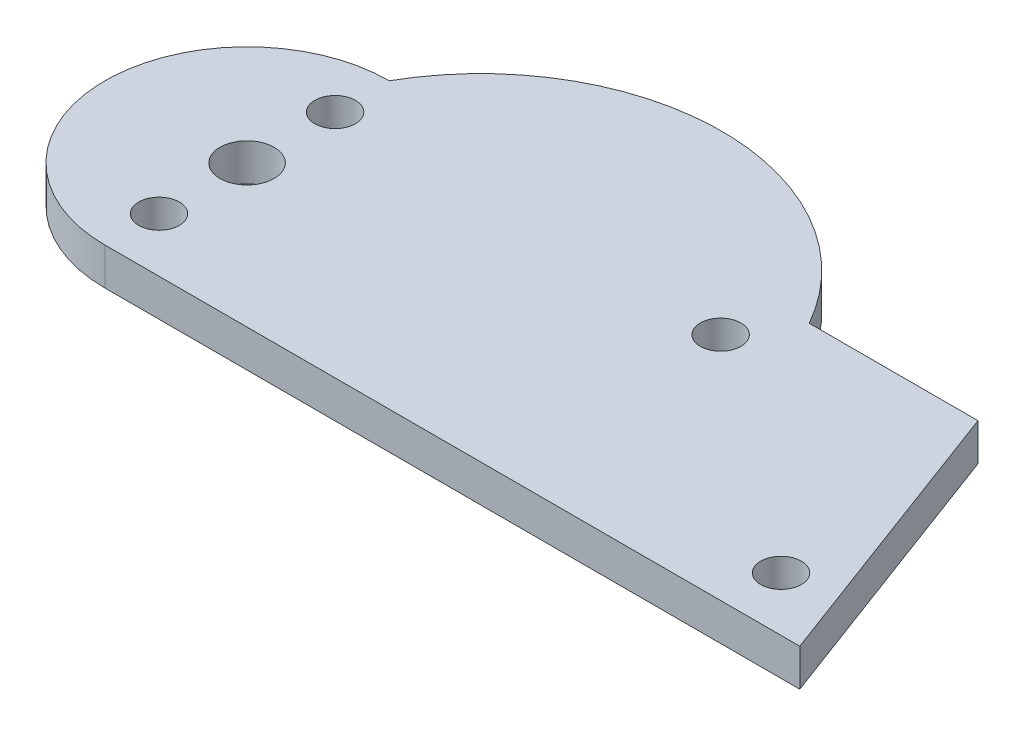
ISO-10303-21;
HEADER;
FILE_DESCRIPTION(('STEP AP214'),'2;1');
FILE_NAME('part.step','',(''),(''),'','','');
FILE_SCHEMA(('AUTOMOTIVE_DESIGN { 1 0 10303 214 1 1 1 1 }'));
ENDSEC;
DATA;
#1=APPLICATION_CONTEXT('core data for automotive mechanical design processes');
#2=APPLICATION_PROTOCOL_DEFINITION('international standard','automotive_design',2000,#1);
#3=PRODUCT_CONTEXT('',#1,'mechanical');
#4=PRODUCT('Part','Part','',(#3));
#5=PRODUCT_RELATED_PRODUCT_CATEGORY('part','',(#4));
#6=PRODUCT_DEFINITION_FORMATION('','',#4);
#7=PRODUCT_DEFINITION_CONTEXT('part definition',#1,'design');
#8=PRODUCT_DEFINITION('design','',#6,#7);
#9=PRODUCT_DEFINITION_SHAPE('','',#8);
#10=(LENGTH_UNIT() NAMED_UNIT(*) SI_UNIT(.MILLI.,.METRE.));
#11=(NAMED_UNIT(*) PLANE_ANGLE_UNIT() SI_UNIT($,.RADIAN.));
#12=(NAMED_UNIT(*) SI_UNIT($,.STERADIAN.) SOLID_ANGLE_UNIT());
#13=UNCERTAINTY_MEASURE_WITH_UNIT(LENGTH_MEASURE(1.E-05),#10,'distance_accuracy_value','');
#14=(GEOMETRIC_REPRESENTATION_CONTEXT(3) GLOBAL_UNCERTAINTY_ASSIGNED_CONTEXT((#13)) GLOBAL_UNIT_ASSIGNED_CONTEXT((#10,
#11,#12)) REPRESENTATION_CONTEXT('',''));
#15=CARTESIAN_POINT('',(0.,0.,0.));
#16=DIRECTION('',(0.,0.,1.));
#17=DIRECTION('',(1.,0.,0.));
#18=AXIS2_PLACEMENT_3D('',#15,#16,#17);
#19=CARTESIAN_POINT('',(0.,2.,0.));
#20=DIRECTION('',(0.,1.,0.));
#21=DIRECTION('',(0.,0.,-1.));
#22=AXIS2_PLACEMENT_3D('',#19,#20,#21);
#23=PLANE('',#22);
#24=CARTESIAN_POINT('',(-40.4241193156667,2.,-1.7460511013579));
#25=DIRECTION('',(0.,1.,0.));
#26=DIRECTION('',(0.,0.,1.));
#27=AXIS2_PLACEMENT_3D('',#24,#25,#26);
#28=CIRCLE('',#27,17.8069548217708);
#29=CARTESIAN_POINT('',(-24.917700351162,2.,-10.5003992165423));
#30=VERTEX_POINT('',#29);
#31=CARTESIAN_POINT('',(-55.9305382801715,2.,-10.5003992165423));
#32=VERTEX_POINT('',#31);
#33=EDGE_CURVE('E110',#30,#32,#28,.T.);
#34=ORIENTED_EDGE('',*,*,#33,.T.);
#35=CARTESIAN_POINT('',(-55.9305382801715,2.,0.));
#36=DIRECTION('',(0.,-1.,0.));
#37=DIRECTION('',(0.,0.,-1.));
#38=AXIS2_PLACEMENT_3D('',#35,#36,#37);
#39=CIRCLE('',#38,10.5003992165423);
#40=CARTESIAN_POINT('',(-55.9305382801715,2.,10.5003992165423));
#41=VERTEX_POINT('',#40);
#42=EDGE_CURVE('E90',#41,#32,#39,.T.);
#43=ORIENTED_EDGE('',*,*,#42,.F.);
#44=DIRECTION('',(1.,0.,0.));
#45=VECTOR('',#44,1.);
#46=CARTESIAN_POINT('',(0.,2.,10.5003992165423));
#47=LINE('',#46,#45);
#48=CARTESIAN_POINT('',(-4.6195471407067,2.,10.5003992165423));
#49=VERTEX_POINT('',#48);
#50=EDGE_CURVE('E99',#41,#49,#47,.T.);
#51=ORIENTED_EDGE('',*,*,#50,.T.);
#52=DIRECTION('',(-0.349715205744596,0.,-0.93685605877905));
#53=VECTOR('',#52,1.);
#54=CARTESIAN_POINT('',(-12.458850175581,2.,-10.5003992165423));
#55=LINE('',#54,#53);
#56=CARTESIAN_POINT('',(-12.458850175581,2.,-10.5003992165423));
#57=VERTEX_POINT('',#56);
#58=EDGE_CURVE('E141',#49,#57,#55,.T.);
#59=ORIENTED_EDGE('',*,*,#58,.T.);
#60=DIRECTION('',(1.,0.,0.));
#61=VECTOR('',#60,1.);
#62=CARTESIAN_POINT('',(0.,2.,-10.5003992165423));
#63=LINE('',#62,#61);
#64=EDGE_CURVE('E111',#30,#57,#63,.T.);
#65=ORIENTED_EDGE('',*,*,#64,.F.);
#66=EDGE_LOOP('',(#34,#43,#51,#59,#65));
#67=FACE_BOUND('',#66,.T.);
#68=CARTESIAN_POINT('',(-55.9305382801715,2.,6.5003992165423));
#69=DIRECTION('',(0.,-1.,0.));
#70=DIRECTION('',(0.,0.,-1.));
#71=AXIS2_PLACEMENT_3D('',#68,#69,#70);
#72=CIRCLE('',#71,1.5);
#73=CARTESIAN_POINT('',(-55.9305382801715,2.,5.0003992165423));
#74=VERTEX_POINT('',#73);
#75=EDGE_CURVE('E158',#74,#74,#72,.F.);
#76=ORIENTED_EDGE('',*,*,#75,.F.);
#77=EDGE_LOOP('',(#76));
#78=FACE_BOUND('',#77,.T.);
#79=CARTESIAN_POINT('',(-55.9305382801715,2.,0.));
#80=DIRECTION('',(0.,-1.,0.));
#81=DIRECTION('',(0.,0.,-1.));
#82=AXIS2_PLACEMENT_3D('',#79,#80,#81);
#83=CIRCLE('',#82,2.);
#84=CARTESIAN_POINT('',(-55.9305382801715,2.,-2.));
#85=VERTEX_POINT('',#84);
#86=EDGE_CURVE('E105',#85,#85,#83,.T.);
#87=ORIENTED_EDGE('',*,*,#86,.T.);
#88=EDGE_LOOP('',(#87));
#89=FACE_BOUND('',#88,.T.);
#90=CARTESIAN_POINT('',(-55.9305382801715,2.,-6.5003992165423));
#91=DIRECTION('',(0.,-1.,0.));
#92=DIRECTION('',(0.,0.,-1.));
#93=AXIS2_PLACEMENT_3D('',#90,#91,#92);
#94=CIRCLE('',#93,1.5);
#95=CARTESIAN_POINT('',(-55.9305382801715,2.,-8.00039921654231));
#96=VERTEX_POINT('',#95);
#97=EDGE_CURVE('E113',#96,#96,#94,.F.);
#98=ORIENTED_EDGE('',*,*,#97,.F.);
#99=EDGE_LOOP('',(#98));
#100=FACE_BOUND('',#99,.T.);
#101=CARTESIAN_POINT('',(-27.4615510728353,2.,-6.5003992165423));
#102=DIRECTION('',(0.,-1.,0.));
#103=DIRECTION('',(0.,0.,-1.));
#104=AXIS2_PLACEMENT_3D('',#101,#102,#103);
#105=CIRCLE('',#104,1.5);
#106=CARTESIAN_POINT('',(-27.4615510728353,2.,-8.00039921654231));
#107=VERTEX_POINT('',#106);
#108=EDGE_CURVE('E152',#107,#107,#105,.F.);
#109=ORIENTED_EDGE('',*,*,#108,.F.);
#110=EDGE_LOOP('',(#109));
#111=FACE_BOUND('',#110,.T.);
#112=CARTESIAN_POINT('',(-10.,2.,6.5003992165423));
#113=DIRECTION('',(0.,-1.,0.));
#114=DIRECTION('',(0.,0.,-1.));
#115=AXIS2_PLACEMENT_3D('',#112,#113,#114);
#116=CIRCLE('',#115,1.5);
#117=CARTESIAN_POINT('',(-10.,2.,5.0003992165423));
#118=VERTEX_POINT('',#117);
#119=EDGE_CURVE('E155',#118,#118,#116,.F.);
#120=ORIENTED_EDGE('',*,*,#119,.F.);
#121=EDGE_LOOP('',(#120));
#122=FACE_BOUND('',#121,.T.);
#123=ADVANCED_FACE('F38',(#67,#78,#89,#100,#111,#122),#23,.T.);
#124=CARTESIAN_POINT('',(0.,-0.75,10.5003992165423));
#125=DIRECTION('',(0.,0.,-1.));
#126=DIRECTION('',(-1.,0.,0.));
#127=AXIS2_PLACEMENT_3D('',#124,#125,#126);
#128=PLANE('',#127);
#129=ORIENTED_EDGE('',*,*,#50,.F.);
#130=DIRECTION('',(0.,1.,0.));
#131=VECTOR('',#130,1.);
#132=CARTESIAN_POINT('',(-55.9305382801715,-0.75,10.5003992165423));
#133=LINE('',#132,#131);
#134=CARTESIAN_POINT('',(-55.9305382801715,-0.75,10.5003992165423));
#135=VERTEX_POINT('',#134);
#136=EDGE_CURVE('E86',#135,#41,#133,.T.);
#137=ORIENTED_EDGE('',*,*,#136,.F.);
#138=DIRECTION('',(1.,0.,0.));
#139=VECTOR('',#138,1.);
#140=CARTESIAN_POINT('',(0.,-0.75,10.5003992165423));
#141=LINE('',#140,#139);
#142=CARTESIAN_POINT('',(-4.6195471407067,-0.75,10.5003992165423));
#143=VERTEX_POINT('',#142);
#144=EDGE_CURVE('E96',#135,#143,#141,.T.);
#145=ORIENTED_EDGE('',*,*,#144,.T.);
#146=DIRECTION('',(0.,-1.,0.));
#147=VECTOR('',#146,1.);
#148=CARTESIAN_POINT('',(-4.6195471407067,33.1152802892206,10.5003992165423));
#149=LINE('',#148,#147);
#150=EDGE_CURVE('E101',#49,#143,#149,.T.);
#151=ORIENTED_EDGE('',*,*,#150,.F.);
#152=EDGE_LOOP('',(#129,#137,#145,#151));
#153=FACE_BOUND('',#152,.T.);
#154=ADVANCED_FACE('F100',(#153),#128,.F.);
#155=CARTESIAN_POINT('',(0.,-0.75,0.));
#156=DIRECTION('',(0.,-1.,0.));
#157=DIRECTION('',(0.,0.,1.));
#158=AXIS2_PLACEMENT_3D('',#155,#156,#157);
#159=PLANE('',#158);
#160=DIRECTION('',(0.349715205744595,0.,0.93685605877905));
#161=VECTOR('',#160,1.);
#162=CARTESIAN_POINT('',(-12.458850175581,-0.75,-10.5003992165423));
#163=LINE('',#162,#161);
#164=CARTESIAN_POINT('',(-12.458850175581,-0.75,-10.5003992165423));
#165=VERTEX_POINT('',#164);
#166=EDGE_CURVE('E11',#165,#143,#163,.T.);
#167=ORIENTED_EDGE('',*,*,#166,.T.);
#168=ORIENTED_EDGE('',*,*,#144,.F.);
#169=CARTESIAN_POINT('',(-55.9305382801715,-0.75,0.));
#170=DIRECTION('',(0.,1.,0.));
#171=DIRECTION('',(0.,0.,1.));
#172=AXIS2_PLACEMENT_3D('',#169,#170,#171);
#173=CIRCLE('',#172,10.5003992165423);
#174=CARTESIAN_POINT('',(-55.9305382801715,-0.749999999999997,-10.5003992165423));
#175=VERTEX_POINT('',#174);
#176=EDGE_CURVE('E93',#175,#135,#173,.T.);
#177=ORIENTED_EDGE('',*,*,#176,.F.);
#178=CARTESIAN_POINT('',(-40.4241193156667,-0.749999999999997,-1.7460511013579));
#179=DIRECTION('',(0.,1.,0.));
#180=DIRECTION('',(0.,0.,1.));
#181=AXIS2_PLACEMENT_3D('',#178,#179,#180);
#182=CIRCLE('',#181,17.8069548217708);
#183=CARTESIAN_POINT('',(-24.917700351162,-0.749999999999997,-10.5003992165423));
#184=VERTEX_POINT('',#183);
#185=EDGE_CURVE('E121',#184,#175,#182,.T.);
#186=ORIENTED_EDGE('',*,*,#185,.F.);
#187=DIRECTION('',(-1.,0.,0.));
#188=VECTOR('',#187,1.);
#189=CARTESIAN_POINT('',(0.,-0.75,-10.5003992165423));
#190=LINE('',#189,#188);
#191=EDGE_CURVE('E126',#165,#184,#190,.T.);
#192=ORIENTED_EDGE('',*,*,#191,.F.);
#193=EDGE_LOOP('',(#167,#168,#177,#186,#192));
#194=FACE_BOUND('',#193,.T.);
#195=CARTESIAN_POINT('',(-55.9305382801715,-0.75,-6.5003992165423));
#196=DIRECTION('',(0.,-1.,0.));
#197=DIRECTION('',(0.,0.,-1.));
#198=AXIS2_PLACEMENT_3D('',#195,#196,#197);
#199=CIRCLE('',#198,1.5);
#200=CARTESIAN_POINT('',(-55.9305382801715,-0.75,-8.00039921654231));
#201=VERTEX_POINT('',#200);
#202=EDGE_CURVE('E138',#201,#201,#199,.T.);
#203=ORIENTED_EDGE('',*,*,#202,.F.);
#204=EDGE_LOOP('',(#203));
#205=FACE_BOUND('',#204,.T.);
#206=CARTESIAN_POINT('',(-55.9305382801715,-0.75,6.5003992165423));
#207=DIRECTION('',(0.,-1.,0.));
#208=DIRECTION('',(0.,0.,-1.));
#209=AXIS2_PLACEMENT_3D('',#206,#207,#208);
#210=CIRCLE('',#209,1.5);
#211=CARTESIAN_POINT('',(-55.9305382801715,-0.75,5.0003992165423));
#212=VERTEX_POINT('',#211);
#213=EDGE_CURVE('E142',#212,#212,#210,.T.);
#214=ORIENTED_EDGE('',*,*,#213,.F.);
#215=EDGE_LOOP('',(#214));
#216=FACE_BOUND('',#215,.T.);
#217=CARTESIAN_POINT('',(-10.,-0.75,6.5003992165423));
#218=DIRECTION('',(0.,-1.,0.));
#219=DIRECTION('',(0.,0.,-1.));
#220=AXIS2_PLACEMENT_3D('',#217,#218,#219);
#221=CIRCLE('',#220,1.5);
#222=CARTESIAN_POINT('',(-10.,-0.75,5.0003992165423));
#223=VERTEX_POINT('',#222);
#224=EDGE_CURVE('E137',#223,#223,#221,.T.);
#225=ORIENTED_EDGE('',*,*,#224,.F.);
#226=EDGE_LOOP('',(#225));
#227=FACE_BOUND('',#226,.T.);
#228=CARTESIAN_POINT('',(-27.4615510728353,-0.75,-6.5003992165423));
#229=DIRECTION('',(0.,-1.,0.));
#230=DIRECTION('',(0.,0.,-1.));
#231=AXIS2_PLACEMENT_3D('',#228,#229,#230);
#232=CIRCLE('',#231,1.5);
#233=CARTESIAN_POINT('',(-27.4615510728353,-0.75,-8.00039921654231));
#234=VERTEX_POINT('',#233);
#235=EDGE_CURVE('E134',#234,#234,#232,.T.);
#236=ORIENTED_EDGE('',*,*,#235,.F.);
#237=EDGE_LOOP('',(#236));
#238=FACE_BOUND('',#237,.T.);
#239=CARTESIAN_POINT('',(-55.9305382801715,-0.75,0.));
#240=DIRECTION('',(0.,1.,0.));
#241=DIRECTION('',(0.,0.,1.));
#242=AXIS2_PLACEMENT_3D('',#239,#240,#241);
#243=CIRCLE('',#242,2.);
#244=CARTESIAN_POINT('',(-55.9305382801715,-0.75,2.));
#245=VERTEX_POINT('',#244);
#246=EDGE_CURVE('E122',#245,#245,#243,.T.);
#247=ORIENTED_EDGE('',*,*,#246,.T.);
#248=EDGE_LOOP('',(#247));
#249=FACE_BOUND('',#248,.T.);
#250=ADVANCED_FACE('F124',(#194,#205,#216,#227,#238,#249),#159,.T.);
#251=CARTESIAN_POINT('',(0.,-0.75,-10.5003992165423));
#252=DIRECTION('',(0.,0.,1.));
#253=DIRECTION('',(1.,0.,0.));
#254=AXIS2_PLACEMENT_3D('',#251,#252,#253);
#255=PLANE('',#254);
#256=ORIENTED_EDGE('',*,*,#64,.T.);
#257=DIRECTION('',(0.,-1.,0.));
#258=VECTOR('',#257,1.);
#259=CARTESIAN_POINT('',(-12.458850175581,33.1152802892206,-10.5003992165423));
#260=LINE('',#259,#258);
#261=EDGE_CURVE('E47',#57,#165,#260,.T.);
#262=ORIENTED_EDGE('',*,*,#261,.T.);
#263=ORIENTED_EDGE('',*,*,#191,.T.);
#264=DIRECTION('',(0.,1.,0.));
#265=VECTOR('',#264,1.);
#266=CARTESIAN_POINT('',(-24.917700351162,-33.0570550282,-10.5003992165423));
#267=LINE('',#266,#265);
#268=EDGE_CURVE('E42',#184,#30,#267,.T.);
#269=ORIENTED_EDGE('',*,*,#268,.T.);
#270=EDGE_LOOP('',(#256,#262,#263,#269));
#271=FACE_BOUND('',#270,.T.);
#272=ADVANCED_FACE('F193',(#271),#255,.F.);
#273=CARTESIAN_POINT('',(-12.458850175581,33.1152802892206,-10.5003992165423));
#274=DIRECTION('',(-0.93685605877905,0.,0.349715205744596));
#275=DIRECTION('',(0.349715205744596,0.,0.93685605877905));
#276=AXIS2_PLACEMENT_3D('',#273,#274,#275);
#277=PLANE('',#276);
#278=ORIENTED_EDGE('',*,*,#58,.F.);
#279=ORIENTED_EDGE('',*,*,#150,.T.);
#280=ORIENTED_EDGE('',*,*,#166,.F.);
#281=ORIENTED_EDGE('',*,*,#261,.F.);
#282=EDGE_LOOP('',(#278,#279,#280,#281));
#283=FACE_BOUND('',#282,.T.);
#284=ADVANCED_FACE('F196',(#283),#277,.F.);
#285=CARTESIAN_POINT('',(-55.9305382801715,-0.75,0.));
#286=DIRECTION('',(0.,1.,0.));
#287=DIRECTION('',(0.,0.,-1.));
#288=AXIS2_PLACEMENT_3D('',#285,#286,#287);
#289=CYLINDRICAL_SURFACE('',#288,10.5003992165423);
#290=ORIENTED_EDGE('',*,*,#42,.T.);
#291=DIRECTION('',(0.,1.,0.));
#292=VECTOR('',#291,1.);
#293=CARTESIAN_POINT('',(-55.9305382801715,-0.75,-10.5003992165423));
#294=LINE('',#293,#292);
#295=EDGE_CURVE('E97',#175,#32,#294,.T.);
#296=ORIENTED_EDGE('',*,*,#295,.F.);
#297=ORIENTED_EDGE('',*,*,#176,.T.);
#298=ORIENTED_EDGE('',*,*,#136,.T.);
#299=EDGE_LOOP('',(#290,#296,#297,#298));
#300=FACE_BOUND('',#299,.T.);
#301=ADVANCED_FACE('F88',(#300),#289,.T.);
#302=CARTESIAN_POINT('',(-40.4241193156667,-33.0570550282,-1.7460511013579));
#303=DIRECTION('',(0.,1.,0.));
#304=DIRECTION('',(0.,0.,-1.));
#305=AXIS2_PLACEMENT_3D('',#302,#303,#304);
#306=CYLINDRICAL_SURFACE('',#305,17.8069548217708);
#307=ORIENTED_EDGE('',*,*,#268,.F.);
#308=ORIENTED_EDGE('',*,*,#185,.T.);
#309=ORIENTED_EDGE('',*,*,#295,.T.);
#310=ORIENTED_EDGE('',*,*,#33,.F.);
#311=EDGE_LOOP('',(#307,#308,#309,#310));
#312=FACE_BOUND('',#311,.T.);
#313=ADVANCED_FACE('F119',(#312),#306,.T.);
#314=CARTESIAN_POINT('',(-55.9305382801715,-0.75,0.));
#315=DIRECTION('',(0.,1.,0.));
#316=DIRECTION('',(0.,0.,-1.));
#317=AXIS2_PLACEMENT_3D('',#314,#315,#316);
#318=CYLINDRICAL_SURFACE('',#317,2.);
#319=ORIENTED_EDGE('',*,*,#246,.F.);
#320=EDGE_LOOP('',(#319));
#321=FACE_BOUND('',#320,.T.);
#322=ORIENTED_EDGE('',*,*,#86,.F.);
#323=EDGE_LOOP('',(#322));
#324=FACE_BOUND('',#323,.T.);
#325=ADVANCED_FACE('F186',(#321,#324),#318,.F.);
#326=CARTESIAN_POINT('',(-55.9305382801715,-0.75,-6.5003992165423));
#327=DIRECTION('',(0.,1.,0.));
#328=DIRECTION('',(0.,0.,-1.));
#329=AXIS2_PLACEMENT_3D('',#326,#327,#328);
#330=CYLINDRICAL_SURFACE('',#329,1.5);
#331=ORIENTED_EDGE('',*,*,#202,.T.);
#332=EDGE_LOOP('',(#331));
#333=FACE_BOUND('',#332,.T.);
#334=ORIENTED_EDGE('',*,*,#97,.T.);
#335=EDGE_LOOP('',(#334));
#336=FACE_BOUND('',#335,.T.);
#337=ADVANCED_FACE('F163',(#333,#336),#330,.F.);
#338=CARTESIAN_POINT('',(-55.9305382801715,-0.75,6.5003992165423));
#339=DIRECTION('',(0.,1.,0.));
#340=DIRECTION('',(0.,0.,-1.));
#341=AXIS2_PLACEMENT_3D('',#338,#339,#340);
#342=CYLINDRICAL_SURFACE('',#341,1.5);
#343=ORIENTED_EDGE('',*,*,#213,.T.);
#344=EDGE_LOOP('',(#343));
#345=FACE_BOUND('',#344,.T.);
#346=ORIENTED_EDGE('',*,*,#75,.T.);
#347=EDGE_LOOP('',(#346));
#348=FACE_BOUND('',#347,.T.);
#349=ADVANCED_FACE('F174',(#345,#348),#342,.F.);
#350=CARTESIAN_POINT('',(-10.,-0.75,6.5003992165423));
#351=DIRECTION('',(0.,1.,0.));
#352=DIRECTION('',(0.,0.,-1.));
#353=AXIS2_PLACEMENT_3D('',#350,#351,#352);
#354=CYLINDRICAL_SURFACE('',#353,1.5);
#355=ORIENTED_EDGE('',*,*,#224,.T.);
#356=EDGE_LOOP('',(#355));
#357=FACE_BOUND('',#356,.T.);
#358=ORIENTED_EDGE('',*,*,#119,.T.);
#359=EDGE_LOOP('',(#358));
#360=FACE_BOUND('',#359,.T.);
#361=ADVANCED_FACE('F172',(#357,#360),#354,.F.);
#362=CARTESIAN_POINT('',(-27.4615510728353,-0.75,-6.5003992165423));
#363=DIRECTION('',(0.,1.,0.));
#364=DIRECTION('',(0.,0.,-1.));
#365=AXIS2_PLACEMENT_3D('',#362,#363,#364);
#366=CYLINDRICAL_SURFACE('',#365,1.5);
#367=ORIENTED_EDGE('',*,*,#235,.T.);
#368=EDGE_LOOP('',(#367));
#369=FACE_BOUND('',#368,.T.);
#370=ORIENTED_EDGE('',*,*,#108,.T.);
#371=EDGE_LOOP('',(#370));
#372=FACE_BOUND('',#371,.T.);
#373=ADVANCED_FACE('F40',(#369,#372),#366,.F.);
#374=CLOSED_SHELL('',(#123,#154,#250,#272,#284,#301,#313,#325,#337,#349,#361,#373));
#375=MANIFOLD_SOLID_BREP('B2',#374);
#376=ADVANCED_BREP_SHAPE_REPRESENTATION('',(#18,#375),#14);
#377=SHAPE_DEFINITION_REPRESENTATION(#9,#376);
ENDSEC;
END-ISO-10303-21;
